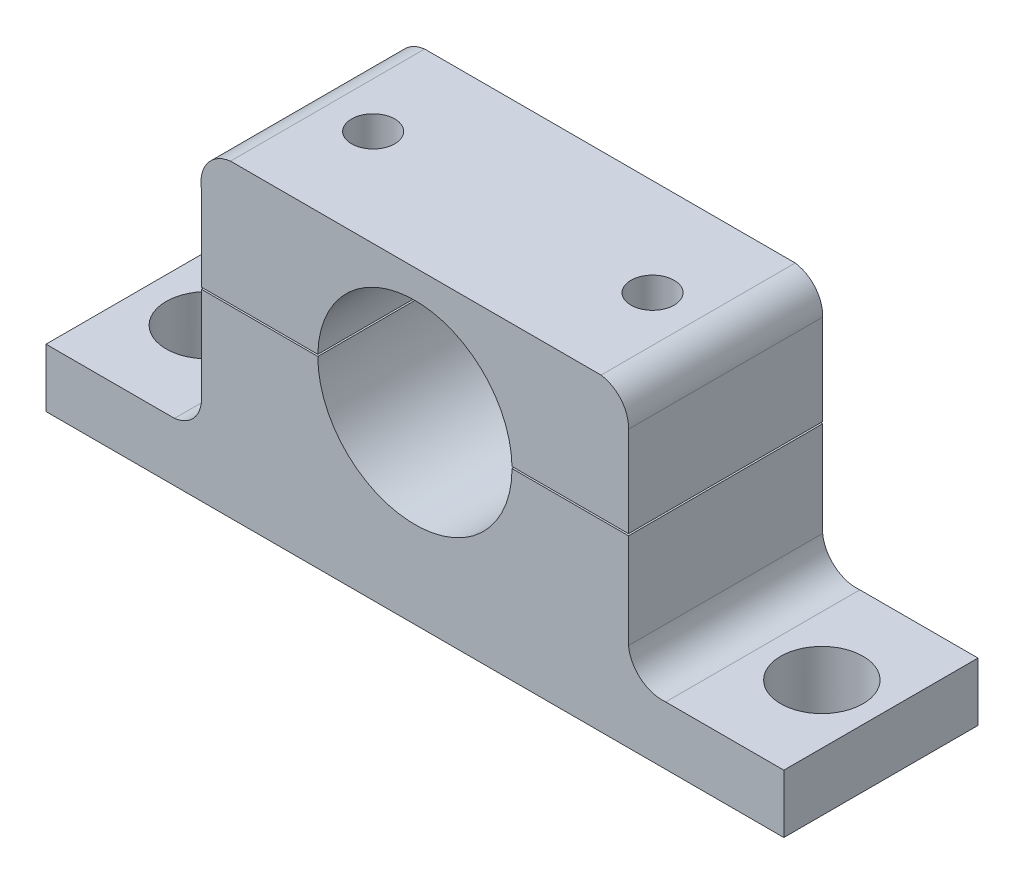
ISO-10303-21;
HEADER;
FILE_DESCRIPTION(('STEP AP214'),'2;1');
FILE_NAME('part.step','',(''),(''),'','','');
FILE_SCHEMA(('AUTOMOTIVE_DESIGN { 1 0 10303 214 1 1 1 1 }'));
ENDSEC;
DATA;
#1=APPLICATION_CONTEXT('core data for automotive mechanical design processes');
#2=APPLICATION_PROTOCOL_DEFINITION('international standard','automotive_design',2000,#1);
#3=PRODUCT_CONTEXT('',#1,'mechanical');
#4=PRODUCT('Part','Part','',(#3));
#5=PRODUCT_RELATED_PRODUCT_CATEGORY('part','',(#4));
#6=PRODUCT_DEFINITION_FORMATION('','',#4);
#7=PRODUCT_DEFINITION_CONTEXT('part definition',#1,'design');
#8=PRODUCT_DEFINITION('design','',#6,#7);
#9=PRODUCT_DEFINITION_SHAPE('','',#8);
#10=(LENGTH_UNIT() NAMED_UNIT(*) SI_UNIT(.MILLI.,.METRE.));
#11=(NAMED_UNIT(*) PLANE_ANGLE_UNIT() SI_UNIT($,.RADIAN.));
#12=(NAMED_UNIT(*) SI_UNIT($,.STERADIAN.) SOLID_ANGLE_UNIT());
#13=UNCERTAINTY_MEASURE_WITH_UNIT(LENGTH_MEASURE(1.E-05),#10,'distance_accuracy_value','');
#14=(GEOMETRIC_REPRESENTATION_CONTEXT(3) GLOBAL_UNCERTAINTY_ASSIGNED_CONTEXT((#13)) GLOBAL_UNIT_ASSIGNED_CONTEXT((#10,
#11,#12)) REPRESENTATION_CONTEXT('',''));
#15=CARTESIAN_POINT('',(0.,0.,0.));
#16=DIRECTION('',(0.,0.,1.));
#17=DIRECTION('',(1.,0.,0.));
#18=AXIS2_PLACEMENT_3D('',#15,#16,#17);
#19=CARTESIAN_POINT('',(13.8735070804667,-2.83207246643306,5.));
#20=DIRECTION('',(0.,0.,-1.));
#21=DIRECTION('',(-1.,0.,0.));
#22=AXIS2_PLACEMENT_3D('',#19,#20,#21);
#23=PLANE('',#22);
#24=DIRECTION('',(-1.,0.,0.));
#25=VECTOR('',#24,1.);
#26=CARTESIAN_POINT('',(13.8735070804667,-0.427274061418186,5.));
#27=LINE('',#26,#25);
#28=CARTESIAN_POINT('',(13.0054185575869,-0.427274061418186,5.));
#29=VERTEX_POINT('',#28);
#30=CARTESIAN_POINT('',(10.0056441806879,-0.427274061418186,5.));
#31=VERTEX_POINT('',#30);
#32=EDGE_CURVE('E62',#29,#31,#27,.T.);
#33=ORIENTED_EDGE('',*,*,#32,.F.);
#34=DIRECTION('',(0.,1.,0.));
#35=VECTOR('',#34,1.);
#36=CARTESIAN_POINT('',(13.0054185575869,1.90277157255279,5.));
#37=LINE('',#36,#35);
#38=CARTESIAN_POINT('',(13.0054185575869,1.90277157255279,5.));
#39=VERTEX_POINT('',#38);
#40=EDGE_CURVE('E120',#29,#39,#37,.T.);
#41=ORIENTED_EDGE('',*,*,#40,.T.);
#42=CARTESIAN_POINT('',(12.1764318169215,1.93641957929441,5.));
#43=DIRECTION('',(0.,0.,1.));
#44=DIRECTION('',(1.,0.,0.));
#45=AXIS2_PLACEMENT_3D('',#42,#43,#44);
#46=CIRCLE('',#45,0.829669334468147);
#47=CARTESIAN_POINT('',(12.2983360441467,2.75708428789436,5.));
#48=VERTEX_POINT('',#47);
#49=EDGE_CURVE('E117',#39,#48,#46,.T.);
#50=ORIENTED_EDGE('',*,*,#49,.T.);
#51=DIRECTION('',(-1.,0.,0.));
#52=VECTOR('',#51,1.);
#53=CARTESIAN_POINT('',(2.75593961372968,2.75708428789436,5.));
#54=LINE('',#53,#52);
#55=CARTESIAN_POINT('',(2.75593961372968,2.75708428789436,5.));
#56=VERTEX_POINT('',#55);
#57=EDGE_CURVE('E140',#48,#56,#54,.T.);
#58=ORIENTED_EDGE('',*,*,#57,.T.);
#59=CARTESIAN_POINT('',(2.85513987815159,1.90277157255279,5.));
#60=DIRECTION('',(0.,0.,1.));
#61=DIRECTION('',(-1.,0.,0.));
#62=AXIS2_PLACEMENT_3D('',#59,#60,#61);
#63=CIRCLE('',#62,0.860052851896716);
#64=CARTESIAN_POINT('',(2.00541855758695,1.76986338832939,5.));
#65=VERTEX_POINT('',#64);
#66=EDGE_CURVE('E142',#56,#65,#63,.T.);
#67=ORIENTED_EDGE('',*,*,#66,.T.);
#68=DIRECTION('',(0.,-1.,0.));
#69=VECTOR('',#68,1.);
#70=CARTESIAN_POINT('',(2.00541855758695,1.76986338832939,5.));
#71=LINE('',#70,#69);
#72=CARTESIAN_POINT('',(2.00541855758695,-0.427274061418186,5.));
#73=VERTEX_POINT('',#72);
#74=EDGE_CURVE('E152',#65,#73,#71,.T.);
#75=ORIENTED_EDGE('',*,*,#74,.T.);
#76=CARTESIAN_POINT('',(5.00519293448603,-0.427274061418186,5.));
#77=VERTEX_POINT('',#76);
#78=EDGE_CURVE('E12',#77,#73,#27,.T.);
#79=ORIENTED_EDGE('',*,*,#78,.F.);
#80=CARTESIAN_POINT('',(7.50541855758695,-0.473834048097698,5.));
#81=DIRECTION('',(0.,0.,1.));
#82=DIRECTION('',(1.,0.,0.));
#83=AXIS2_PLACEMENT_3D('',#80,#81,#82);
#84=CIRCLE('',#83,2.50065911286804);
#85=EDGE_CURVE('E159',#31,#77,#84,.T.);
#86=ORIENTED_EDGE('',*,*,#85,.F.);
#87=EDGE_LOOP('',(#33,#41,#50,#58,#67,#75,#79,#86));
#88=FACE_BOUND('',#87,.T.);
#89=ADVANCED_FACE('F51',(#88),#23,.F.);
#90=CARTESIAN_POINT('',(13.8735070804667,-2.83207246643306,0.));
#91=DIRECTION('',(0.,0.,-1.));
#92=DIRECTION('',(-1.,0.,0.));
#93=AXIS2_PLACEMENT_3D('',#90,#91,#92);
#94=PLANE('',#93);
#95=DIRECTION('',(0.,1.,0.));
#96=VECTOR('',#95,1.);
#97=CARTESIAN_POINT('',(13.0054185575869,1.90277157255279,0.));
#98=LINE('',#97,#96);
#99=CARTESIAN_POINT('',(13.0054185575869,-0.427274061418186,0.));
#100=VERTEX_POINT('',#99);
#101=CARTESIAN_POINT('',(13.0054185575869,1.90277157255279,0.));
#102=VERTEX_POINT('',#101);
#103=EDGE_CURVE('E130',#100,#102,#98,.T.);
#104=ORIENTED_EDGE('',*,*,#103,.F.);
#105=DIRECTION('',(-1.,0.,0.));
#106=VECTOR('',#105,1.);
#107=CARTESIAN_POINT('',(13.8735070804667,-0.427274061418186,0.));
#108=LINE('',#107,#106);
#109=CARTESIAN_POINT('',(10.0056441806879,-0.427274061418186,0.));
#110=VERTEX_POINT('',#109);
#111=EDGE_CURVE('E87',#100,#110,#108,.T.);
#112=ORIENTED_EDGE('',*,*,#111,.T.);
#113=CARTESIAN_POINT('',(7.50541855758695,-0.473834048097698,0.));
#114=DIRECTION('',(0.,0.,1.));
#115=DIRECTION('',(1.,0.,0.));
#116=AXIS2_PLACEMENT_3D('',#113,#114,#115);
#117=CIRCLE('',#116,2.50065911286804);
#118=CARTESIAN_POINT('',(5.00519293448603,-0.427274061418186,0.));
#119=VERTEX_POINT('',#118);
#120=EDGE_CURVE('E151',#110,#119,#117,.T.);
#121=ORIENTED_EDGE('',*,*,#120,.T.);
#122=CARTESIAN_POINT('',(2.00541855758695,-0.427274061418186,0.));
#123=VERTEX_POINT('',#122);
#124=EDGE_CURVE('E153',#119,#123,#108,.T.);
#125=ORIENTED_EDGE('',*,*,#124,.T.);
#126=DIRECTION('',(0.,-1.,0.));
#127=VECTOR('',#126,1.);
#128=CARTESIAN_POINT('',(2.00541855758695,1.76986338832939,0.));
#129=LINE('',#128,#127);
#130=CARTESIAN_POINT('',(2.00541855758695,1.76986338832939,0.));
#131=VERTEX_POINT('',#130);
#132=EDGE_CURVE('E156',#131,#123,#129,.T.);
#133=ORIENTED_EDGE('',*,*,#132,.F.);
#134=CARTESIAN_POINT('',(2.85513987815159,1.90277157255279,0.));
#135=DIRECTION('',(0.,0.,1.));
#136=DIRECTION('',(-1.,0.,0.));
#137=AXIS2_PLACEMENT_3D('',#134,#135,#136);
#138=CIRCLE('',#137,0.860052851896716);
#139=CARTESIAN_POINT('',(2.75593961372968,2.75708428789436,0.));
#140=VERTEX_POINT('',#139);
#141=EDGE_CURVE('E183',#140,#131,#138,.T.);
#142=ORIENTED_EDGE('',*,*,#141,.F.);
#143=DIRECTION('',(-1.,0.,0.));
#144=VECTOR('',#143,1.);
#145=CARTESIAN_POINT('',(2.75593961372968,2.75708428789436,0.));
#146=LINE('',#145,#144);
#147=CARTESIAN_POINT('',(12.2983360441467,2.75708428789436,0.));
#148=VERTEX_POINT('',#147);
#149=EDGE_CURVE('E133',#148,#140,#146,.T.);
#150=ORIENTED_EDGE('',*,*,#149,.F.);
#151=CARTESIAN_POINT('',(12.1764318169215,1.93641957929441,0.));
#152=DIRECTION('',(0.,0.,1.));
#153=DIRECTION('',(1.,0.,0.));
#154=AXIS2_PLACEMENT_3D('',#151,#152,#153);
#155=CIRCLE('',#154,0.829669334468147);
#156=EDGE_CURVE('E134',#102,#148,#155,.T.);
#157=ORIENTED_EDGE('',*,*,#156,.F.);
#158=EDGE_LOOP('',(#104,#112,#121,#125,#133,#142,#150,#157));
#159=FACE_BOUND('',#158,.T.);
#160=ADVANCED_FACE('F204',(#159),#94,.T.);
#161=CARTESIAN_POINT('',(13.0054185575869,1.90277157255279,5.));
#162=DIRECTION('',(-1.,0.,0.));
#163=DIRECTION('',(0.,0.,1.));
#164=AXIS2_PLACEMENT_3D('',#161,#162,#163);
#165=PLANE('',#164);
#166=DIRECTION('',(0.,0.,1.));
#167=VECTOR('',#166,1.);
#168=CARTESIAN_POINT('',(13.0054185575869,-0.427274061418186,5.));
#169=LINE('',#168,#167);
#170=EDGE_CURVE('E147',#100,#29,#169,.T.);
#171=ORIENTED_EDGE('',*,*,#170,.F.);
#172=ORIENTED_EDGE('',*,*,#103,.T.);
#173=DIRECTION('',(0.,0.,-1.));
#174=VECTOR('',#173,1.);
#175=CARTESIAN_POINT('',(13.0054185575869,1.90277157255279,5.));
#176=LINE('',#175,#174);
#177=EDGE_CURVE('E127',#39,#102,#176,.T.);
#178=ORIENTED_EDGE('',*,*,#177,.F.);
#179=ORIENTED_EDGE('',*,*,#40,.F.);
#180=EDGE_LOOP('',(#171,#172,#178,#179));
#181=FACE_BOUND('',#180,.T.);
#182=ADVANCED_FACE('F128',(#181),#165,.F.);
#183=CARTESIAN_POINT('',(2.00541855758695,1.76986338832939,5.));
#184=DIRECTION('',(1.,0.,0.));
#185=DIRECTION('',(0.,0.,-1.));
#186=AXIS2_PLACEMENT_3D('',#183,#184,#185);
#187=PLANE('',#186);
#188=DIRECTION('',(0.,0.,-1.));
#189=VECTOR('',#188,1.);
#190=CARTESIAN_POINT('',(2.00541855758695,-0.427274061418186,5.));
#191=LINE('',#190,#189);
#192=EDGE_CURVE('E60',#73,#123,#191,.T.);
#193=ORIENTED_EDGE('',*,*,#192,.F.);
#194=ORIENTED_EDGE('',*,*,#74,.F.);
#195=DIRECTION('',(0.,0.,-1.));
#196=VECTOR('',#195,1.);
#197=CARTESIAN_POINT('',(2.00541855758695,1.76986338832939,5.));
#198=LINE('',#197,#196);
#199=EDGE_CURVE('E160',#65,#131,#198,.T.);
#200=ORIENTED_EDGE('',*,*,#199,.T.);
#201=ORIENTED_EDGE('',*,*,#132,.T.);
#202=EDGE_LOOP('',(#193,#194,#200,#201));
#203=FACE_BOUND('',#202,.T.);
#204=ADVANCED_FACE('F199',(#203),#187,.F.);
#205=CARTESIAN_POINT('',(7.50541855758695,-0.473834048097698,5.));
#206=DIRECTION('',(0.,0.,-1.));
#207=DIRECTION('',(-1.,0.,0.));
#208=AXIS2_PLACEMENT_3D('',#205,#206,#207);
#209=CYLINDRICAL_SURFACE('',#208,2.50065911286804);
#210=ORIENTED_EDGE('',*,*,#85,.T.);
#211=DIRECTION('',(0.,0.,-1.));
#212=VECTOR('',#211,1.);
#213=CARTESIAN_POINT('',(5.00519293448603,-0.427274061418186,5.));
#214=LINE('',#213,#212);
#215=EDGE_CURVE('E164',#77,#119,#214,.T.);
#216=ORIENTED_EDGE('',*,*,#215,.T.);
#217=ORIENTED_EDGE('',*,*,#120,.F.);
#218=DIRECTION('',(0.,0.,-1.));
#219=VECTOR('',#218,1.);
#220=CARTESIAN_POINT('',(10.0056441806879,-0.427274061418186,5.));
#221=LINE('',#220,#219);
#222=EDGE_CURVE('E91',#110,#31,#221,.F.);
#223=ORIENTED_EDGE('',*,*,#222,.T.);
#224=EDGE_LOOP('',(#210,#216,#217,#223));
#225=FACE_BOUND('',#224,.T.);
#226=ADVANCED_FACE('F207',(#225),#209,.F.);
#227=CARTESIAN_POINT('',(12.1764318169215,1.93641957929441,5.));
#228=DIRECTION('',(0.,0.,-1.));
#229=DIRECTION('',(-1.,0.,0.));
#230=AXIS2_PLACEMENT_3D('',#227,#228,#229);
#231=CYLINDRICAL_SURFACE('',#230,0.829669334468147);
#232=ORIENTED_EDGE('',*,*,#156,.T.);
#233=DIRECTION('',(0.,0.,-1.));
#234=VECTOR('',#233,1.);
#235=CARTESIAN_POINT('',(12.2983360441467,2.75708428789436,5.));
#236=LINE('',#235,#234);
#237=EDGE_CURVE('E138',#48,#148,#236,.T.);
#238=ORIENTED_EDGE('',*,*,#237,.F.);
#239=ORIENTED_EDGE('',*,*,#49,.F.);
#240=ORIENTED_EDGE('',*,*,#177,.T.);
#241=EDGE_LOOP('',(#232,#238,#239,#240));
#242=FACE_BOUND('',#241,.T.);
#243=ADVANCED_FACE('F136',(#242),#231,.T.);
#244=CARTESIAN_POINT('',(2.75593961372968,2.75708428789436,5.));
#245=DIRECTION('',(0.,-1.,0.));
#246=DIRECTION('',(0.,0.,-1.));
#247=AXIS2_PLACEMENT_3D('',#244,#245,#246);
#248=PLANE('',#247);
#249=CARTESIAN_POINT('',(3.92989586473291,2.75708428789436,2.5));
#250=DIRECTION('',(0.,-1.,0.));
#251=DIRECTION('',(0.,0.,-1.));
#252=AXIS2_PLACEMENT_3D('',#249,#250,#251);
#253=CIRCLE('',#252,0.5563646495459);
#254=CARTESIAN_POINT('',(3.92989586473291,2.75708428789436,1.9436353504541));
#255=VERTEX_POINT('',#254);
#256=EDGE_CURVE('E168',#255,#255,#253,.F.);
#257=ORIENTED_EDGE('',*,*,#256,.F.);
#258=EDGE_LOOP('',(#257));
#259=FACE_BOUND('',#258,.T.);
#260=CARTESIAN_POINT('',(11.124813260297,2.75708428789436,2.5));
#261=DIRECTION('',(0.,-1.,0.));
#262=DIRECTION('',(0.,0.,-1.));
#263=AXIS2_PLACEMENT_3D('',#260,#261,#262);
#264=CIRCLE('',#263,0.5563646495459);
#265=CARTESIAN_POINT('',(11.124813260297,2.75708428789436,1.9436353504541));
#266=VERTEX_POINT('',#265);
#267=EDGE_CURVE('E124',#266,#266,#264,.F.);
#268=ORIENTED_EDGE('',*,*,#267,.F.);
#269=EDGE_LOOP('',(#268));
#270=FACE_BOUND('',#269,.T.);
#271=ORIENTED_EDGE('',*,*,#149,.T.);
#272=DIRECTION('',(0.,0.,-1.));
#273=VECTOR('',#272,1.);
#274=CARTESIAN_POINT('',(2.75593961372968,2.75708428789436,5.));
#275=LINE('',#274,#273);
#276=EDGE_CURVE('E148',#56,#140,#275,.T.);
#277=ORIENTED_EDGE('',*,*,#276,.F.);
#278=ORIENTED_EDGE('',*,*,#57,.F.);
#279=ORIENTED_EDGE('',*,*,#237,.T.);
#280=EDGE_LOOP('',(#271,#277,#278,#279));
#281=FACE_BOUND('',#280,.T.);
#282=ADVANCED_FACE('F214',(#259,#270,#281),#248,.F.);
#283=CARTESIAN_POINT('',(2.85513987815159,1.90277157255279,5.));
#284=DIRECTION('',(0.,0.,-1.));
#285=DIRECTION('',(-1.,0.,0.));
#286=AXIS2_PLACEMENT_3D('',#283,#284,#285);
#287=CYLINDRICAL_SURFACE('',#286,0.860052851896716);
#288=ORIENTED_EDGE('',*,*,#141,.T.);
#289=ORIENTED_EDGE('',*,*,#199,.F.);
#290=ORIENTED_EDGE('',*,*,#66,.F.);
#291=ORIENTED_EDGE('',*,*,#276,.T.);
#292=EDGE_LOOP('',(#288,#289,#290,#291));
#293=FACE_BOUND('',#292,.T.);
#294=ADVANCED_FACE('F195',(#293),#287,.T.);
#295=CARTESIAN_POINT('',(15.4999454421447,-0.427274061418186,7.));
#296=DIRECTION('',(0.,-1.,0.));
#297=DIRECTION('',(0.,0.,-1.));
#298=AXIS2_PLACEMENT_3D('',#295,#296,#297);
#299=PLANE('',#298);
#300=CARTESIAN_POINT('',(11.124813260297,-0.427274061418186,2.5));
#301=DIRECTION('',(0.,-1.,0.));
#302=DIRECTION('',(0.,0.,-1.));
#303=AXIS2_PLACEMENT_3D('',#300,#301,#302);
#304=CIRCLE('',#303,0.5563646495459);
#305=CARTESIAN_POINT('',(11.124813260297,-0.427274061418186,1.9436353504541));
#306=VERTEX_POINT('',#305);
#307=EDGE_CURVE('E54',#306,#306,#304,.F.);
#308=ORIENTED_EDGE('',*,*,#307,.T.);
#309=EDGE_LOOP('',(#308));
#310=FACE_BOUND('',#309,.T.);
#311=ORIENTED_EDGE('',*,*,#170,.T.);
#312=ORIENTED_EDGE('',*,*,#32,.T.);
#313=ORIENTED_EDGE('',*,*,#222,.F.);
#314=ORIENTED_EDGE('',*,*,#111,.F.);
#315=EDGE_LOOP('',(#311,#312,#313,#314));
#316=FACE_BOUND('',#315,.T.);
#317=ADVANCED_FACE('F231',(#310,#316),#299,.T.);
#318=CARTESIAN_POINT('',(3.92989586473291,-0.427274061418186,2.5));
#319=DIRECTION('',(0.,-1.,0.));
#320=DIRECTION('',(0.,0.,-1.));
#321=AXIS2_PLACEMENT_3D('',#318,#319,#320);
#322=CIRCLE('',#321,0.5563646495459);
#323=CARTESIAN_POINT('',(3.92989586473291,-0.427274061418186,1.9436353504541));
#324=VERTEX_POINT('',#323);
#325=EDGE_CURVE('E166',#324,#324,#322,.F.);
#326=ORIENTED_EDGE('',*,*,#325,.T.);
#327=EDGE_LOOP('',(#326));
#328=FACE_BOUND('',#327,.T.);
#329=ORIENTED_EDGE('',*,*,#192,.T.);
#330=ORIENTED_EDGE('',*,*,#124,.F.);
#331=ORIENTED_EDGE('',*,*,#215,.F.);
#332=ORIENTED_EDGE('',*,*,#78,.T.);
#333=EDGE_LOOP('',(#329,#330,#331,#332));
#334=FACE_BOUND('',#333,.T.);
#335=ADVANCED_FACE('F202',(#328,#334),#299,.T.);
#336=CARTESIAN_POINT('',(3.92989586473291,3.75708428789436,2.5));
#337=DIRECTION('',(0.,-1.,0.));
#338=DIRECTION('',(0.,0.,-1.));
#339=AXIS2_PLACEMENT_3D('',#336,#337,#338);
#340=CYLINDRICAL_SURFACE('',#339,0.5563646495459);
#341=ORIENTED_EDGE('',*,*,#325,.F.);
#342=EDGE_LOOP('',(#341));
#343=FACE_BOUND('',#342,.T.);
#344=ORIENTED_EDGE('',*,*,#256,.T.);
#345=EDGE_LOOP('',(#344));
#346=FACE_BOUND('',#345,.T.);
#347=ADVANCED_FACE('F230',(#343,#346),#340,.F.);
#348=CARTESIAN_POINT('',(11.124813260297,3.75708428789436,2.5));
#349=DIRECTION('',(0.,-1.,0.));
#350=DIRECTION('',(0.,0.,-1.));
#351=AXIS2_PLACEMENT_3D('',#348,#349,#350);
#352=CYLINDRICAL_SURFACE('',#351,0.5563646495459);
#353=ORIENTED_EDGE('',*,*,#307,.F.);
#354=EDGE_LOOP('',(#353));
#355=FACE_BOUND('',#354,.T.);
#356=ORIENTED_EDGE('',*,*,#267,.T.);
#357=EDGE_LOOP('',(#356));
#358=FACE_BOUND('',#357,.T.);
#359=ADVANCED_FACE('F237',(#355,#358),#352,.F.);
#360=CLOSED_SHELL('',(#89,#160,#182,#204,#226,#243,#282,#294,#317,#335,#347,#359));
#361=MANIFOLD_SOLID_BREP('B2',#360);
#362=CARTESIAN_POINT('',(1.31408699591911,-3.70016098931282,5.));
#363=DIRECTION('',(0.,-1.,0.));
#364=DIRECTION('',(0.,0.,-1.));
#365=AXIS2_PLACEMENT_3D('',#362,#363,#364);
#366=PLANE('',#365);
#367=CARTESIAN_POINT('',(-0.340247223246971,-3.70016098931282,2.5));
#368=DIRECTION('',(0.,-1.,0.));
#369=DIRECTION('',(0.,0.,-1.));
#370=AXIS2_PLACEMENT_3D('',#367,#368,#369);
#371=CIRCLE('',#370,1.06076141053467);
#372=CARTESIAN_POINT('',(-0.340247223246971,-3.70016098931282,1.43923858946533));
#373=VERTEX_POINT('',#372);
#374=EDGE_CURVE('E425',#373,#373,#371,.F.);
#375=ORIENTED_EDGE('',*,*,#374,.F.);
#376=EDGE_LOOP('',(#375));
#377=FACE_BOUND('',#376,.T.);
#378=DIRECTION('',(-1.,0.,0.));
#379=VECTOR('',#378,1.);
#380=CARTESIAN_POINT('',(1.31408699591911,-3.70016098931282,0.));
#381=LINE('',#380,#379);
#382=CARTESIAN_POINT('',(1.31408699591911,-3.70016098931282,0.));
#383=VERTEX_POINT('',#382);
#384=CARTESIAN_POINT('',(-1.99458144241305,-3.70016098931282,0.));
#385=VERTEX_POINT('',#384);
#386=EDGE_CURVE('E488',#383,#385,#381,.T.);
#387=ORIENTED_EDGE('',*,*,#386,.T.);
#388=DIRECTION('',(0.,0.,-1.));
#389=VECTOR('',#388,1.);
#390=CARTESIAN_POINT('',(-1.99458144241305,-3.70016098931282,5.));
#391=LINE('',#390,#389);
#392=CARTESIAN_POINT('',(-1.99458144241305,-3.70016098931282,5.));
#393=VERTEX_POINT('',#392);
#394=EDGE_CURVE('E503',#393,#385,#391,.T.);
#395=ORIENTED_EDGE('',*,*,#394,.F.);
#396=DIRECTION('',(-1.,0.,0.));
#397=VECTOR('',#396,1.);
#398=CARTESIAN_POINT('',(1.31408699591911,-3.70016098931282,5.));
#399=LINE('',#398,#397);
#400=CARTESIAN_POINT('',(1.31408699591911,-3.70016098931282,5.));
#401=VERTEX_POINT('',#400);
#402=EDGE_CURVE('E460',#401,#393,#399,.T.);
#403=ORIENTED_EDGE('',*,*,#402,.F.);
#404=DIRECTION('',(0.,0.,-1.));
#405=VECTOR('',#404,1.);
#406=CARTESIAN_POINT('',(1.31408699591911,-3.70016098931282,5.));
#407=LINE('',#406,#405);
#408=EDGE_CURVE('E507',#401,#383,#407,.T.);
#409=ORIENTED_EDGE('',*,*,#408,.T.);
#410=EDGE_LOOP('',(#387,#395,#403,#409));
#411=FACE_BOUND('',#410,.T.);
#412=ADVANCED_FACE('F318',(#377,#411),#366,.F.);
#413=CARTESIAN_POINT('',(-1.99458144241305,-3.70016098931282,5.));
#414=DIRECTION('',(1.,0.,0.));
#415=DIRECTION('',(0.,0.,-1.));
#416=AXIS2_PLACEMENT_3D('',#413,#414,#415);
#417=PLANE('',#416);
#418=DIRECTION('',(0.,-1.,0.));
#419=VECTOR('',#418,1.);
#420=CARTESIAN_POINT('',(-1.99458144241305,-3.70016098931282,0.));
#421=LINE('',#420,#419);
#422=CARTESIAN_POINT('',(-1.99458144241305,-5.2033414677264,0.));
#423=VERTEX_POINT('',#422);
#424=EDGE_CURVE('E491',#385,#423,#421,.T.);
#425=ORIENTED_EDGE('',*,*,#424,.T.);
#426=DIRECTION('',(0.,0.,-1.));
#427=VECTOR('',#426,1.);
#428=CARTESIAN_POINT('',(-1.99458144241305,-5.2033414677264,5.));
#429=LINE('',#428,#427);
#430=CARTESIAN_POINT('',(-1.99458144241305,-5.2033414677264,5.));
#431=VERTEX_POINT('',#430);
#432=EDGE_CURVE('E499',#431,#423,#429,.T.);
#433=ORIENTED_EDGE('',*,*,#432,.F.);
#434=DIRECTION('',(0.,-1.,0.));
#435=VECTOR('',#434,1.);
#436=CARTESIAN_POINT('',(-1.99458144241305,-3.70016098931282,5.));
#437=LINE('',#436,#435);
#438=EDGE_CURVE('E463',#393,#431,#437,.T.);
#439=ORIENTED_EDGE('',*,*,#438,.F.);
#440=ORIENTED_EDGE('',*,*,#394,.T.);
#441=EDGE_LOOP('',(#425,#433,#439,#440));
#442=FACE_BOUND('',#441,.T.);
#443=ADVANCED_FACE('F594',(#442),#417,.F.);
#444=CARTESIAN_POINT('',(-1.99458144241305,-5.2033414677264,5.));
#445=DIRECTION('',(0.,1.,0.));
#446=DIRECTION('',(0.,0.,1.));
#447=AXIS2_PLACEMENT_3D('',#444,#445,#446);
#448=PLANE('',#447);
#449=CARTESIAN_POINT('',(3.92989586473291,-5.2033414677264,2.5));
#450=DIRECTION('',(0.,1.,0.));
#451=DIRECTION('',(0.,0.,1.));
#452=AXIS2_PLACEMENT_3D('',#449,#450,#451);
#453=CIRCLE('',#452,0.5563646495459);
#454=CARTESIAN_POINT('',(3.92989586473291,-5.2033414677264,3.0563646495459));
#455=VERTEX_POINT('',#454);
#456=EDGE_CURVE('E531',#455,#455,#453,.F.);
#457=ORIENTED_EDGE('',*,*,#456,.F.);
#458=EDGE_LOOP('',(#457));
#459=FACE_BOUND('',#458,.T.);
#460=CARTESIAN_POINT('',(11.124813260297,-5.2033414677264,2.5));
#461=DIRECTION('',(0.,1.,0.));
#462=DIRECTION('',(0.,0.,1.));
#463=AXIS2_PLACEMENT_3D('',#460,#461,#462);
#464=CIRCLE('',#463,0.5563646495459);
#465=CARTESIAN_POINT('',(11.124813260297,-5.2033414677264,3.0563646495459));
#466=VERTEX_POINT('',#465);
#467=EDGE_CURVE('E538',#466,#466,#464,.F.);
#468=ORIENTED_EDGE('',*,*,#467,.F.);
#469=EDGE_LOOP('',(#468));
#470=FACE_BOUND('',#469,.T.);
#471=CARTESIAN_POINT('',(15.4842863189809,-5.2033414677264,2.5));
#472=DIRECTION('',(0.,1.,0.));
#473=DIRECTION('',(0.,0.,1.));
#474=AXIS2_PLACEMENT_3D('',#471,#472,#473);
#475=CIRCLE('',#474,1.06076141053467);
#476=CARTESIAN_POINT('',(15.4842863189809,-5.2033414677264,3.56076141053467));
#477=VERTEX_POINT('',#476);
#478=EDGE_CURVE('E530',#477,#477,#475,.F.);
#479=ORIENTED_EDGE('',*,*,#478,.F.);
#480=EDGE_LOOP('',(#479));
#481=FACE_BOUND('',#480,.T.);
#482=CARTESIAN_POINT('',(-0.340247223246971,-5.2033414677264,2.5));
#483=DIRECTION('',(0.,1.,0.));
#484=DIRECTION('',(0.,0.,1.));
#485=AXIS2_PLACEMENT_3D('',#482,#483,#484);
#486=CIRCLE('',#485,1.06076141053467);
#487=CARTESIAN_POINT('',(-0.340247223246971,-5.2033414677264,3.56076141053467));
#488=VERTEX_POINT('',#487);
#489=EDGE_CURVE('E532',#488,#488,#486,.F.);
#490=ORIENTED_EDGE('',*,*,#489,.F.);
#491=EDGE_LOOP('',(#490));
#492=FACE_BOUND('',#491,.T.);
#493=DIRECTION('',(1.,0.,0.));
#494=VECTOR('',#493,1.);
#495=CARTESIAN_POINT('',(-1.99458144241305,-5.2033414677264,0.));
#496=LINE('',#495,#494);
#497=CARTESIAN_POINT('',(17.0054185575869,-5.2033414677264,0.));
#498=VERTEX_POINT('',#497);
#499=EDGE_CURVE('E444',#423,#498,#496,.T.);
#500=ORIENTED_EDGE('',*,*,#499,.T.);
#501=DIRECTION('',(0.,0.,-1.));
#502=VECTOR('',#501,1.);
#503=CARTESIAN_POINT('',(17.0054185575869,-5.2033414677264,5.));
#504=LINE('',#503,#502);
#505=CARTESIAN_POINT('',(17.0054185575869,-5.2033414677264,5.));
#506=VERTEX_POINT('',#505);
#507=EDGE_CURVE('E469',#506,#498,#504,.T.);
#508=ORIENTED_EDGE('',*,*,#507,.F.);
#509=DIRECTION('',(1.,0.,0.));
#510=VECTOR('',#509,1.);
#511=CARTESIAN_POINT('',(-1.99458144241305,-5.2033414677264,5.));
#512=LINE('',#511,#510);
#513=EDGE_CURVE('E466',#431,#506,#512,.T.);
#514=ORIENTED_EDGE('',*,*,#513,.F.);
#515=ORIENTED_EDGE('',*,*,#432,.T.);
#516=EDGE_LOOP('',(#500,#508,#514,#515));
#517=FACE_BOUND('',#516,.T.);
#518=ADVANCED_FACE('F589',(#459,#470,#481,#492,#517),#448,.F.);
#519=CARTESIAN_POINT('',(17.0054185575869,-5.2033414677264,5.));
#520=DIRECTION('',(-1.,0.,0.));
#521=DIRECTION('',(0.,0.,1.));
#522=AXIS2_PLACEMENT_3D('',#519,#520,#521);
#523=PLANE('',#522);
#524=DIRECTION('',(0.,1.,0.));
#525=VECTOR('',#524,1.);
#526=CARTESIAN_POINT('',(17.0054185575869,-5.2033414677264,0.));
#527=LINE('',#526,#525);
#528=CARTESIAN_POINT('',(17.0054185575869,-3.70016098931282,0.));
#529=VERTEX_POINT('',#528);
#530=EDGE_CURVE('E434',#498,#529,#527,.T.);
#531=ORIENTED_EDGE('',*,*,#530,.T.);
#532=DIRECTION('',(0.,0.,-1.));
#533=VECTOR('',#532,1.);
#534=CARTESIAN_POINT('',(17.0054185575869,-3.70016098931282,5.));
#535=LINE('',#534,#533);
#536=CARTESIAN_POINT('',(17.0054185575869,-3.70016098931282,5.));
#537=VERTEX_POINT('',#536);
#538=EDGE_CURVE('E415',#537,#529,#535,.T.);
#539=ORIENTED_EDGE('',*,*,#538,.F.);
#540=DIRECTION('',(0.,1.,0.));
#541=VECTOR('',#540,1.);
#542=CARTESIAN_POINT('',(17.0054185575869,-5.2033414677264,5.));
#543=LINE('',#542,#541);
#544=EDGE_CURVE('E439',#506,#537,#543,.T.);
#545=ORIENTED_EDGE('',*,*,#544,.F.);
#546=ORIENTED_EDGE('',*,*,#507,.T.);
#547=EDGE_LOOP('',(#531,#539,#545,#546));
#548=FACE_BOUND('',#547,.T.);
#549=ADVANCED_FACE('F320',(#548),#523,.F.);
#550=CARTESIAN_POINT('',(13.9631540803748,-3.70016098931282,5.));
#551=DIRECTION('',(0.,-1.,0.));
#552=DIRECTION('',(0.,0.,-1.));
#553=AXIS2_PLACEMENT_3D('',#550,#551,#552);
#554=PLANE('',#553);
#555=CARTESIAN_POINT('',(15.4842863189809,-3.70016098931282,2.5));
#556=DIRECTION('',(0.,-1.,0.));
#557=DIRECTION('',(0.,0.,-1.));
#558=AXIS2_PLACEMENT_3D('',#555,#556,#557);
#559=CIRCLE('',#558,1.06076141053467);
#560=CARTESIAN_POINT('',(15.4842863189809,-3.70016098931282,1.43923858946533));
#561=VERTEX_POINT('',#560);
#562=EDGE_CURVE('E526',#561,#561,#559,.F.);
#563=ORIENTED_EDGE('',*,*,#562,.F.);
#564=EDGE_LOOP('',(#563));
#565=FACE_BOUND('',#564,.T.);
#566=DIRECTION('',(-1.,0.,0.));
#567=VECTOR('',#566,1.);
#568=CARTESIAN_POINT('',(13.9631540803748,-3.70016098931282,0.));
#569=LINE('',#568,#567);
#570=CARTESIAN_POINT('',(13.9631540803748,-3.70016098931282,0.));
#571=VERTEX_POINT('',#570);
#572=EDGE_CURVE('E473',#529,#571,#569,.T.);
#573=ORIENTED_EDGE('',*,*,#572,.T.);
#574=DIRECTION('',(0.,0.,-1.));
#575=VECTOR('',#574,1.);
#576=CARTESIAN_POINT('',(13.9631540803748,-3.70016098931282,5.));
#577=LINE('',#576,#575);
#578=CARTESIAN_POINT('',(13.9631540803748,-3.70016098931282,5.));
#579=VERTEX_POINT('',#578);
#580=EDGE_CURVE('E519',#579,#571,#577,.T.);
#581=ORIENTED_EDGE('',*,*,#580,.F.);
#582=DIRECTION('',(-1.,0.,0.));
#583=VECTOR('',#582,1.);
#584=CARTESIAN_POINT('',(13.9631540803748,-3.70016098931282,5.));
#585=LINE('',#584,#583);
#586=EDGE_CURVE('E443',#537,#579,#585,.T.);
#587=ORIENTED_EDGE('',*,*,#586,.F.);
#588=ORIENTED_EDGE('',*,*,#538,.T.);
#589=EDGE_LOOP('',(#573,#581,#587,#588));
#590=FACE_BOUND('',#589,.T.);
#591=ADVANCED_FACE('F583',(#565,#590),#554,.F.);
#592=CARTESIAN_POINT('',(13.8735070804667,-2.83207246643306,5.));
#593=DIRECTION('',(0.,0.,-1.));
#594=DIRECTION('',(-1.,0.,0.));
#595=AXIS2_PLACEMENT_3D('',#592,#593,#594);
#596=CYLINDRICAL_SURFACE('',#595,0.872705143876266);
#597=CARTESIAN_POINT('',(13.8735070804667,-2.83207246643306,0.));
#598=DIRECTION('',(0.,0.,-1.));
#599=DIRECTION('',(-1.,0.,0.));
#600=AXIS2_PLACEMENT_3D('',#597,#598,#599);
#601=CIRCLE('',#600,0.872705143876266);
#602=CARTESIAN_POINT('',(13.0054185575869,-2.92171946634119,0.));
#603=VERTEX_POINT('',#602);
#604=EDGE_CURVE('E476',#571,#603,#601,.T.);
#605=ORIENTED_EDGE('',*,*,#604,.T.);
#606=DIRECTION('',(0.,0.,-1.));
#607=VECTOR('',#606,1.);
#608=CARTESIAN_POINT('',(13.0054185575869,-2.92171946634119,5.));
#609=LINE('',#608,#607);
#610=CARTESIAN_POINT('',(13.0054185575869,-2.92171946634119,5.));
#611=VERTEX_POINT('',#610);
#612=EDGE_CURVE('E515',#611,#603,#609,.T.);
#613=ORIENTED_EDGE('',*,*,#612,.F.);
#614=CARTESIAN_POINT('',(13.8735070804667,-2.83207246643306,5.));
#615=DIRECTION('',(0.,0.,-1.));
#616=DIRECTION('',(-1.,0.,0.));
#617=AXIS2_PLACEMENT_3D('',#614,#615,#616);
#618=CIRCLE('',#617,0.872705143876266);
#619=EDGE_CURVE('E447',#579,#611,#618,.T.);
#620=ORIENTED_EDGE('',*,*,#619,.F.);
#621=ORIENTED_EDGE('',*,*,#580,.T.);
#622=EDGE_LOOP('',(#605,#613,#620,#621));
#623=FACE_BOUND('',#622,.T.);
#624=ADVANCED_FACE('F577',(#623),#596,.F.);
#625=CARTESIAN_POINT('',(1.22697703461531,-2.92171946634119,5.));
#626=DIRECTION('',(0.,0.,-1.));
#627=DIRECTION('',(-1.,0.,0.));
#628=AXIS2_PLACEMENT_3D('',#625,#626,#627);
#629=CYLINDRICAL_SURFACE('',#628,0.783300293658024);
#630=CARTESIAN_POINT('',(1.22697703461531,-2.92171946634119,0.));
#631=DIRECTION('',(0.,0.,-1.));
#632=DIRECTION('',(-1.,0.,0.));
#633=AXIS2_PLACEMENT_3D('',#630,#631,#632);
#634=CIRCLE('',#633,0.783300293658024);
#635=CARTESIAN_POINT('',(2.00541855758695,-2.83460950503741,0.));
#636=VERTEX_POINT('',#635);
#637=EDGE_CURVE('E485',#636,#383,#634,.T.);
#638=ORIENTED_EDGE('',*,*,#637,.T.);
#639=ORIENTED_EDGE('',*,*,#408,.F.);
#640=CARTESIAN_POINT('',(1.22697703461531,-2.92171946634119,5.));
#641=DIRECTION('',(0.,0.,-1.));
#642=DIRECTION('',(-1.,0.,0.));
#643=AXIS2_PLACEMENT_3D('',#640,#641,#642);
#644=CIRCLE('',#643,0.783300293658024);
#645=CARTESIAN_POINT('',(2.00541855758695,-2.83460950503741,5.));
#646=VERTEX_POINT('',#645);
#647=EDGE_CURVE('E457',#646,#401,#644,.T.);
#648=ORIENTED_EDGE('',*,*,#647,.F.);
#649=DIRECTION('',(0.,0.,-1.));
#650=VECTOR('',#649,1.);
#651=CARTESIAN_POINT('',(2.00541855758695,-2.83460950503741,5.));
#652=LINE('',#651,#650);
#653=EDGE_CURVE('E511',#646,#636,#652,.T.);
#654=ORIENTED_EDGE('',*,*,#653,.T.);
#655=EDGE_LOOP('',(#638,#639,#648,#654));
#656=FACE_BOUND('',#655,.T.);
#657=ADVANCED_FACE('F602',(#656),#629,.F.);
#658=CARTESIAN_POINT('',(13.0054185575869,1.90277157255279,5.));
#659=DIRECTION('',(-1.,0.,0.));
#660=DIRECTION('',(0.,0.,1.));
#661=AXIS2_PLACEMENT_3D('',#658,#659,#660);
#662=PLANE('',#661);
#663=DIRECTION('',(0.,0.,-1.));
#664=VECTOR('',#663,1.);
#665=CARTESIAN_POINT('',(13.0054185575869,-0.473834048097698,5.));
#666=LINE('',#665,#664);
#667=CARTESIAN_POINT('',(13.0054185575869,-0.473834048097698,5.));
#668=VERTEX_POINT('',#667);
#669=CARTESIAN_POINT('',(13.0054185575869,-0.473834048097698,0.));
#670=VERTEX_POINT('',#669);
#671=EDGE_CURVE('E430',#668,#670,#666,.T.);
#672=ORIENTED_EDGE('',*,*,#671,.F.);
#673=DIRECTION('',(0.,1.,0.));
#674=VECTOR('',#673,1.);
#675=CARTESIAN_POINT('',(13.0054185575869,1.90277157255279,5.));
#676=LINE('',#675,#674);
#677=EDGE_CURVE('E450',#611,#668,#676,.T.);
#678=ORIENTED_EDGE('',*,*,#677,.F.);
#679=ORIENTED_EDGE('',*,*,#612,.T.);
#680=DIRECTION('',(0.,1.,0.));
#681=VECTOR('',#680,1.);
#682=CARTESIAN_POINT('',(13.0054185575869,1.90277157255279,0.));
#683=LINE('',#682,#681);
#684=EDGE_CURVE('E479',#603,#670,#683,.T.);
#685=ORIENTED_EDGE('',*,*,#684,.T.);
#686=EDGE_LOOP('',(#672,#678,#679,#685));
#687=FACE_BOUND('',#686,.T.);
#688=ADVANCED_FACE('F571',(#687),#662,.F.);
#689=CARTESIAN_POINT('',(7.50541855758695,-0.473834048097698,5.));
#690=DIRECTION('',(0.,0.,-1.));
#691=DIRECTION('',(-1.,0.,0.));
#692=AXIS2_PLACEMENT_3D('',#689,#690,#691);
#693=CYLINDRICAL_SURFACE('',#692,2.50065911286804);
#694=CARTESIAN_POINT('',(7.50541855758695,-0.473834048097698,5.));
#695=DIRECTION('',(0.,0.,1.));
#696=DIRECTION('',(1.,0.,0.));
#697=AXIS2_PLACEMENT_3D('',#694,#695,#696);
#698=CIRCLE('',#697,2.50065911286804);
#699=CARTESIAN_POINT('',(5.00475944471891,-0.473834048097698,5.));
#700=VERTEX_POINT('',#699);
#701=CARTESIAN_POINT('',(10.006077670455,-0.473834048097698,5.));
#702=VERTEX_POINT('',#701);
#703=EDGE_CURVE('E429',#700,#702,#698,.T.);
#704=ORIENTED_EDGE('',*,*,#703,.T.);
#705=DIRECTION('',(0.,0.,-1.));
#706=VECTOR('',#705,1.);
#707=CARTESIAN_POINT('',(10.006077670455,-0.473834048097698,5.));
#708=LINE('',#707,#706);
#709=CARTESIAN_POINT('',(10.006077670455,-0.473834048097698,0.));
#710=VERTEX_POINT('',#709);
#711=EDGE_CURVE('E49',#702,#710,#708,.T.);
#712=ORIENTED_EDGE('',*,*,#711,.T.);
#713=CARTESIAN_POINT('',(7.50541855758695,-0.473834048097698,0.));
#714=DIRECTION('',(0.,0.,1.));
#715=DIRECTION('',(1.,0.,0.));
#716=AXIS2_PLACEMENT_3D('',#713,#714,#715);
#717=CIRCLE('',#716,2.50065911286804);
#718=CARTESIAN_POINT('',(5.00475944471891,-0.473834048097698,0.));
#719=VERTEX_POINT('',#718);
#720=EDGE_CURVE('E421',#719,#710,#717,.T.);
#721=ORIENTED_EDGE('',*,*,#720,.F.);
#722=DIRECTION('',(0.,0.,-1.));
#723=VECTOR('',#722,1.);
#724=CARTESIAN_POINT('',(5.00475944471891,-0.473834048097698,5.));
#725=LINE('',#724,#723);
#726=EDGE_CURVE('E328',#719,#700,#725,.F.);
#727=ORIENTED_EDGE('',*,*,#726,.T.);
#728=EDGE_LOOP('',(#704,#712,#721,#727));
#729=FACE_BOUND('',#728,.T.);
#730=ADVANCED_FACE('F427',(#729),#693,.F.);
#731=CARTESIAN_POINT('',(2.00541855758695,1.76986338832939,5.));
#732=DIRECTION('',(1.,0.,0.));
#733=DIRECTION('',(0.,0.,-1.));
#734=AXIS2_PLACEMENT_3D('',#731,#732,#733);
#735=PLANE('',#734);
#736=DIRECTION('',(0.,0.,1.));
#737=VECTOR('',#736,1.);
#738=CARTESIAN_POINT('',(2.00541855758695,-0.473834048097698,5.));
#739=LINE('',#738,#737);
#740=CARTESIAN_POINT('',(2.00541855758695,-0.473834048097698,0.));
#741=VERTEX_POINT('',#740);
#742=CARTESIAN_POINT('',(2.00541855758695,-0.473834048097698,5.));
#743=VERTEX_POINT('',#742);
#744=EDGE_CURVE('E560',#741,#743,#739,.T.);
#745=ORIENTED_EDGE('',*,*,#744,.F.);
#746=DIRECTION('',(0.,-1.,0.));
#747=VECTOR('',#746,1.);
#748=CARTESIAN_POINT('',(2.00541855758695,1.76986338832939,0.));
#749=LINE('',#748,#747);
#750=EDGE_CURVE('E423',#741,#636,#749,.T.);
#751=ORIENTED_EDGE('',*,*,#750,.T.);
#752=ORIENTED_EDGE('',*,*,#653,.F.);
#753=DIRECTION('',(0.,-1.,0.));
#754=VECTOR('',#753,1.);
#755=CARTESIAN_POINT('',(2.00541855758695,1.76986338832939,5.));
#756=LINE('',#755,#754);
#757=EDGE_CURVE('E454',#743,#646,#756,.T.);
#758=ORIENTED_EDGE('',*,*,#757,.F.);
#759=EDGE_LOOP('',(#745,#751,#752,#758));
#760=FACE_BOUND('',#759,.T.);
#761=ADVANCED_FACE('F606',(#760),#735,.F.);
#762=CARTESIAN_POINT('',(13.8735070804667,-2.83207246643306,0.));
#763=DIRECTION('',(0.,0.,-1.));
#764=DIRECTION('',(-1.,0.,0.));
#765=AXIS2_PLACEMENT_3D('',#762,#763,#764);
#766=PLANE('',#765);
#767=ORIENTED_EDGE('',*,*,#750,.F.);
#768=DIRECTION('',(1.,0.,0.));
#769=VECTOR('',#768,1.);
#770=CARTESIAN_POINT('',(13.8735070804667,-0.473834048097698,0.));
#771=LINE('',#770,#769);
#772=EDGE_CURVE('E408',#741,#719,#771,.T.);
#773=ORIENTED_EDGE('',*,*,#772,.T.);
#774=ORIENTED_EDGE('',*,*,#720,.T.);
#775=EDGE_CURVE('E336',#710,#670,#771,.T.);
#776=ORIENTED_EDGE('',*,*,#775,.T.);
#777=ORIENTED_EDGE('',*,*,#684,.F.);
#778=ORIENTED_EDGE('',*,*,#604,.F.);
#779=ORIENTED_EDGE('',*,*,#572,.F.);
#780=ORIENTED_EDGE('',*,*,#530,.F.);
#781=ORIENTED_EDGE('',*,*,#499,.F.);
#782=ORIENTED_EDGE('',*,*,#424,.F.);
#783=ORIENTED_EDGE('',*,*,#386,.F.);
#784=ORIENTED_EDGE('',*,*,#637,.F.);
#785=EDGE_LOOP('',(#767,#773,#774,#776,#777,#778,#779,#780,#781,#782,#783,#784));
#786=FACE_BOUND('',#785,.T.);
#787=ADVANCED_FACE('F420',(#786),#766,.T.);
#788=CARTESIAN_POINT('',(13.8735070804667,-2.83207246643306,5.));
#789=DIRECTION('',(0.,0.,-1.));
#790=DIRECTION('',(-1.,0.,0.));
#791=AXIS2_PLACEMENT_3D('',#788,#789,#790);
#792=PLANE('',#791);
#793=DIRECTION('',(1.,0.,0.));
#794=VECTOR('',#793,1.);
#795=CARTESIAN_POINT('',(13.8735070804667,-0.473834048097698,5.));
#796=LINE('',#795,#794);
#797=EDGE_CURVE('E343',#743,#700,#796,.T.);
#798=ORIENTED_EDGE('',*,*,#797,.F.);
#799=ORIENTED_EDGE('',*,*,#757,.T.);
#800=ORIENTED_EDGE('',*,*,#647,.T.);
#801=ORIENTED_EDGE('',*,*,#402,.T.);
#802=ORIENTED_EDGE('',*,*,#438,.T.);
#803=ORIENTED_EDGE('',*,*,#513,.T.);
#804=ORIENTED_EDGE('',*,*,#544,.T.);
#805=ORIENTED_EDGE('',*,*,#586,.T.);
#806=ORIENTED_EDGE('',*,*,#619,.T.);
#807=ORIENTED_EDGE('',*,*,#677,.T.);
#808=EDGE_CURVE('E436',#702,#668,#796,.T.);
#809=ORIENTED_EDGE('',*,*,#808,.F.);
#810=ORIENTED_EDGE('',*,*,#703,.F.);
#811=EDGE_LOOP('',(#798,#799,#800,#801,#802,#803,#804,#805,#806,#807,#809,#810));
#812=FACE_BOUND('',#811,.T.);
#813=ADVANCED_FACE('F572',(#812),#792,.F.);
#814=CARTESIAN_POINT('',(15.4999454421447,-0.473834048097698,7.));
#815=DIRECTION('',(0.,1.,0.));
#816=DIRECTION('',(0.,0.,1.));
#817=AXIS2_PLACEMENT_3D('',#814,#815,#816);
#818=PLANE('',#817);
#819=CARTESIAN_POINT('',(3.92989586473291,-0.473834048097698,2.5));
#820=DIRECTION('',(0.,1.,0.));
#821=DIRECTION('',(0.,0.,1.));
#822=AXIS2_PLACEMENT_3D('',#819,#820,#821);
#823=CIRCLE('',#822,0.5563646495459);
#824=CARTESIAN_POINT('',(3.92989586473291,-0.473834048097698,3.0563646495459));
#825=VERTEX_POINT('',#824);
#826=EDGE_CURVE('E322',#825,#825,#823,.F.);
#827=ORIENTED_EDGE('',*,*,#826,.T.);
#828=EDGE_LOOP('',(#827));
#829=FACE_BOUND('',#828,.T.);
#830=ORIENTED_EDGE('',*,*,#744,.T.);
#831=ORIENTED_EDGE('',*,*,#797,.T.);
#832=ORIENTED_EDGE('',*,*,#726,.F.);
#833=ORIENTED_EDGE('',*,*,#772,.F.);
#834=EDGE_LOOP('',(#830,#831,#832,#833));
#835=FACE_BOUND('',#834,.T.);
#836=ADVANCED_FACE('F407',(#829,#835),#818,.T.);
#837=CARTESIAN_POINT('',(11.124813260297,-0.473834048097698,2.5));
#838=DIRECTION('',(0.,1.,0.));
#839=DIRECTION('',(0.,0.,1.));
#840=AXIS2_PLACEMENT_3D('',#837,#838,#839);
#841=CIRCLE('',#840,0.5563646495459);
#842=CARTESIAN_POINT('',(11.124813260297,-0.473834048097698,3.0563646495459));
#843=VERTEX_POINT('',#842);
#844=EDGE_CURVE('E535',#843,#843,#841,.F.);
#845=ORIENTED_EDGE('',*,*,#844,.T.);
#846=EDGE_LOOP('',(#845));
#847=FACE_BOUND('',#846,.T.);
#848=ORIENTED_EDGE('',*,*,#671,.T.);
#849=ORIENTED_EDGE('',*,*,#775,.F.);
#850=ORIENTED_EDGE('',*,*,#711,.F.);
#851=ORIENTED_EDGE('',*,*,#808,.T.);
#852=EDGE_LOOP('',(#848,#849,#850,#851));
#853=FACE_BOUND('',#852,.T.);
#854=ADVANCED_FACE('F567',(#847,#853),#818,.T.);
#855=CARTESIAN_POINT('',(15.4842863189809,-2.70016098931282,2.5));
#856=DIRECTION('',(0.,-1.,0.));
#857=DIRECTION('',(0.,0.,-1.));
#858=AXIS2_PLACEMENT_3D('',#855,#856,#857);
#859=CYLINDRICAL_SURFACE('',#858,1.06076141053467);
#860=ORIENTED_EDGE('',*,*,#562,.T.);
#861=EDGE_LOOP('',(#860));
#862=FACE_BOUND('',#861,.T.);
#863=ORIENTED_EDGE('',*,*,#478,.T.);
#864=EDGE_LOOP('',(#863));
#865=FACE_BOUND('',#864,.T.);
#866=ADVANCED_FACE('F641',(#862,#865),#859,.F.);
#867=CARTESIAN_POINT('',(-0.340247223246971,-2.70016098931282,2.5));
#868=DIRECTION('',(0.,-1.,0.));
#869=DIRECTION('',(0.,0.,-1.));
#870=AXIS2_PLACEMENT_3D('',#867,#868,#869);
#871=CYLINDRICAL_SURFACE('',#870,1.06076141053467);
#872=ORIENTED_EDGE('',*,*,#489,.T.);
#873=EDGE_LOOP('',(#872));
#874=FACE_BOUND('',#873,.T.);
#875=ORIENTED_EDGE('',*,*,#374,.T.);
#876=EDGE_LOOP('',(#875));
#877=FACE_BOUND('',#876,.T.);
#878=ADVANCED_FACE('F644',(#874,#877),#871,.F.);
#879=CARTESIAN_POINT('',(11.124813260297,3.75708428789436,2.5));
#880=DIRECTION('',(0.,-1.,0.));
#881=DIRECTION('',(0.,0.,-1.));
#882=AXIS2_PLACEMENT_3D('',#879,#880,#881);
#883=CYLINDRICAL_SURFACE('',#882,0.5563646495459);
#884=ORIENTED_EDGE('',*,*,#844,.F.);
#885=EDGE_LOOP('',(#884));
#886=FACE_BOUND('',#885,.T.);
#887=ORIENTED_EDGE('',*,*,#467,.T.);
#888=EDGE_LOOP('',(#887));
#889=FACE_BOUND('',#888,.T.);
#890=ADVANCED_FACE('F655',(#886,#889),#883,.F.);
#891=CARTESIAN_POINT('',(3.92989586473291,3.75708428789436,2.5));
#892=DIRECTION('',(0.,-1.,0.));
#893=DIRECTION('',(0.,0.,-1.));
#894=AXIS2_PLACEMENT_3D('',#891,#892,#893);
#895=CYLINDRICAL_SURFACE('',#894,0.5563646495459);
#896=ORIENTED_EDGE('',*,*,#826,.F.);
#897=EDGE_LOOP('',(#896));
#898=FACE_BOUND('',#897,.T.);
#899=ORIENTED_EDGE('',*,*,#456,.T.);
#900=EDGE_LOOP('',(#899));
#901=FACE_BOUND('',#900,.T.);
#902=ADVANCED_FACE('F660',(#898,#901),#895,.F.);
#903=CLOSED_SHELL('',(#412,#443,#518,#549,#591,#624,#657,#688,#730,#761,#787,#813,#836,#854,
#866,#878,#890,#902));
#904=MANIFOLD_SOLID_BREP('B6',#903);
#905=ADVANCED_BREP_SHAPE_REPRESENTATION('',(#18,#361,#904),#14);
#906=SHAPE_DEFINITION_REPRESENTATION(#9,#905);
ENDSEC;
END-ISO-10303-21;
